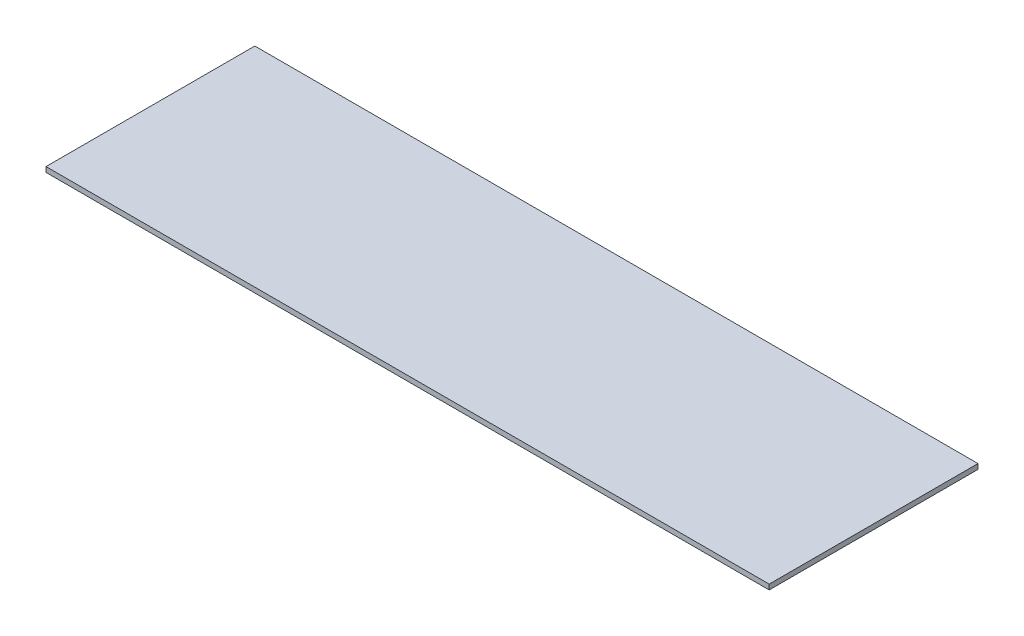
ISO-10303-21;
HEADER;
FILE_DESCRIPTION(('STEP AP214'),'2;1');
FILE_NAME('part.step','',(''),(''),'','','');
FILE_SCHEMA(('AUTOMOTIVE_DESIGN { 1 0 10303 214 1 1 1 1 }'));
ENDSEC;
DATA;
#1=APPLICATION_CONTEXT('core data for automotive mechanical design processes');
#2=APPLICATION_PROTOCOL_DEFINITION('international standard','automotive_design',2000,#1);
#3=PRODUCT_CONTEXT('',#1,'mechanical');
#4=PRODUCT('Part','Part','',(#3));
#5=PRODUCT_RELATED_PRODUCT_CATEGORY('part','',(#4));
#6=PRODUCT_DEFINITION_FORMATION('','',#4);
#7=PRODUCT_DEFINITION_CONTEXT('part definition',#1,'design');
#8=PRODUCT_DEFINITION('design','',#6,#7);
#9=PRODUCT_DEFINITION_SHAPE('','',#8);
#10=(LENGTH_UNIT() NAMED_UNIT(*) SI_UNIT(.MILLI.,.METRE.));
#11=(NAMED_UNIT(*) PLANE_ANGLE_UNIT() SI_UNIT($,.RADIAN.));
#12=(NAMED_UNIT(*) SI_UNIT($,.STERADIAN.) SOLID_ANGLE_UNIT());
#13=UNCERTAINTY_MEASURE_WITH_UNIT(LENGTH_MEASURE(1.E-05),#10,'distance_accuracy_value','');
#14=(GEOMETRIC_REPRESENTATION_CONTEXT(3) GLOBAL_UNCERTAINTY_ASSIGNED_CONTEXT((#13)) GLOBAL_UNIT_ASSIGNED_CONTEXT((#10,
#11,#12)) REPRESENTATION_CONTEXT('',''));
#15=CARTESIAN_POINT('',(0.,0.,0.));
#16=DIRECTION('',(0.,0.,1.));
#17=DIRECTION('',(1.,0.,0.));
#18=AXIS2_PLACEMENT_3D('',#15,#16,#17);
#19=CARTESIAN_POINT('',(-72.8229335931372,-3.175,-90.5464558157828));
#20=DIRECTION('',(-1.,0.,0.));
#21=DIRECTION('',(0.,0.,1.));
#22=AXIS2_PLACEMENT_3D('',#19,#20,#21);
#23=PLANE('',#22);
#24=DIRECTION('',(0.,0.,1.));
#25=VECTOR('',#24,1.);
#26=CARTESIAN_POINT('',(-72.8229335931372,0.,-90.5464558157828));
#27=LINE('',#26,#25);
#28=CARTESIAN_POINT('',(-72.8229335931372,0.,-90.5464558157828));
#29=VERTEX_POINT('',#28);
#30=CARTESIAN_POINT('',(-72.8229335931372,0.,39.6285441842172));
#31=VERTEX_POINT('',#30);
#32=EDGE_CURVE('E97',#29,#31,#27,.T.);
#33=ORIENTED_EDGE('',*,*,#32,.F.);
#34=DIRECTION('',(0.,1.,0.));
#35=VECTOR('',#34,1.);
#36=CARTESIAN_POINT('',(-72.8229335931372,-3.175,-90.5464558157828));
#37=LINE('',#36,#35);
#38=CARTESIAN_POINT('',(-72.8229335931372,-3.175,-90.5464558157828));
#39=VERTEX_POINT('',#38);
#40=EDGE_CURVE('E11',#39,#29,#37,.T.);
#41=ORIENTED_EDGE('',*,*,#40,.F.);
#42=DIRECTION('',(0.,0.,1.));
#43=VECTOR('',#42,1.);
#44=CARTESIAN_POINT('',(-72.8229335931372,-3.175,-90.5464558157828));
#45=LINE('',#44,#43);
#46=CARTESIAN_POINT('',(-72.8229335931372,-3.175,39.6285441842172));
#47=VERTEX_POINT('',#46);
#48=EDGE_CURVE('E91',#39,#47,#45,.T.);
#49=ORIENTED_EDGE('',*,*,#48,.T.);
#50=DIRECTION('',(0.,1.,0.));
#51=VECTOR('',#50,1.);
#52=CARTESIAN_POINT('',(-72.8229335931372,-3.175,39.6285441842172));
#53=LINE('',#52,#51);
#54=EDGE_CURVE('E36',#47,#31,#53,.T.);
#55=ORIENTED_EDGE('',*,*,#54,.T.);
#56=EDGE_LOOP('',(#33,#41,#49,#55));
#57=FACE_BOUND('',#56,.T.);
#58=ADVANCED_FACE('F33',(#57),#23,.T.);
#59=CARTESIAN_POINT('',(-72.8229335931372,-3.175,-90.5464558157828));
#60=DIRECTION('',(0.,0.,-1.));
#61=DIRECTION('',(-1.,0.,0.));
#62=AXIS2_PLACEMENT_3D('',#59,#60,#61);
#63=PLANE('',#62);
#64=DIRECTION('',(-1.,0.,0.));
#65=VECTOR('',#64,1.);
#66=CARTESIAN_POINT('',(-72.8229335931372,0.,-90.5464558157828));
#67=LINE('',#66,#65);
#68=CARTESIAN_POINT('',(378.027066406863,0.,-90.5464558157828));
#69=VERTEX_POINT('',#68);
#70=EDGE_CURVE('E93',#69,#29,#67,.T.);
#71=ORIENTED_EDGE('',*,*,#70,.F.);
#72=DIRECTION('',(0.,1.,0.));
#73=VECTOR('',#72,1.);
#74=CARTESIAN_POINT('',(378.027066406863,-3.175,-90.5464558157828));
#75=LINE('',#74,#73);
#76=CARTESIAN_POINT('',(378.027066406863,-3.175,-90.5464558157828));
#77=VERTEX_POINT('',#76);
#78=EDGE_CURVE('E42',#77,#69,#75,.T.);
#79=ORIENTED_EDGE('',*,*,#78,.F.);
#80=DIRECTION('',(-1.,0.,0.));
#81=VECTOR('',#80,1.);
#82=CARTESIAN_POINT('',(-72.8229335931372,-3.175,-90.5464558157828));
#83=LINE('',#82,#81);
#84=EDGE_CURVE('E88',#77,#39,#83,.T.);
#85=ORIENTED_EDGE('',*,*,#84,.T.);
#86=ORIENTED_EDGE('',*,*,#40,.T.);
#87=EDGE_LOOP('',(#71,#79,#85,#86));
#88=FACE_BOUND('',#87,.T.);
#89=ADVANCED_FACE('F107',(#88),#63,.T.);
#90=CARTESIAN_POINT('',(378.027066406863,-3.175,-90.5464558157828));
#91=DIRECTION('',(1.,0.,0.));
#92=DIRECTION('',(0.,0.,-1.));
#93=AXIS2_PLACEMENT_3D('',#90,#91,#92);
#94=PLANE('',#93);
#95=DIRECTION('',(0.,0.,-1.));
#96=VECTOR('',#95,1.);
#97=CARTESIAN_POINT('',(378.027066406863,0.,-90.5464558157828));
#98=LINE('',#97,#96);
#99=CARTESIAN_POINT('',(378.027066406863,0.,39.6285441842172));
#100=VERTEX_POINT('',#99);
#101=EDGE_CURVE('E83',#100,#69,#98,.T.);
#102=ORIENTED_EDGE('',*,*,#101,.F.);
#103=DIRECTION('',(0.,1.,0.));
#104=VECTOR('',#103,1.);
#105=CARTESIAN_POINT('',(378.027066406863,-3.175,39.6285441842172));
#106=LINE('',#105,#104);
#107=CARTESIAN_POINT('',(378.027066406863,-3.175,39.6285441842172));
#108=VERTEX_POINT('',#107);
#109=EDGE_CURVE('E78',#108,#100,#106,.T.);
#110=ORIENTED_EDGE('',*,*,#109,.F.);
#111=DIRECTION('',(0.,0.,-1.));
#112=VECTOR('',#111,1.);
#113=CARTESIAN_POINT('',(378.027066406863,-3.175,-90.5464558157828));
#114=LINE('',#113,#112);
#115=EDGE_CURVE('E81',#108,#77,#114,.T.);
#116=ORIENTED_EDGE('',*,*,#115,.T.);
#117=ORIENTED_EDGE('',*,*,#78,.T.);
#118=EDGE_LOOP('',(#102,#110,#116,#117));
#119=FACE_BOUND('',#118,.T.);
#120=ADVANCED_FACE('F80',(#119),#94,.T.);
#121=CARTESIAN_POINT('',(-72.8229335931372,-3.175,39.6285441842172));
#122=DIRECTION('',(0.,0.,1.));
#123=DIRECTION('',(1.,0.,0.));
#124=AXIS2_PLACEMENT_3D('',#121,#122,#123);
#125=PLANE('',#124);
#126=DIRECTION('',(1.,0.,0.));
#127=VECTOR('',#126,1.);
#128=CARTESIAN_POINT('',(-72.8229335931372,0.,39.6285441842172));
#129=LINE('',#128,#127);
#130=EDGE_CURVE('E100',#31,#100,#129,.T.);
#131=ORIENTED_EDGE('',*,*,#130,.F.);
#132=ORIENTED_EDGE('',*,*,#54,.F.);
#133=DIRECTION('',(1.,0.,0.));
#134=VECTOR('',#133,1.);
#135=CARTESIAN_POINT('',(-72.8229335931372,-3.175,39.6285441842172));
#136=LINE('',#135,#134);
#137=EDGE_CURVE('E87',#47,#108,#136,.T.);
#138=ORIENTED_EDGE('',*,*,#137,.T.);
#139=ORIENTED_EDGE('',*,*,#109,.T.);
#140=EDGE_LOOP('',(#131,#132,#138,#139));
#141=FACE_BOUND('',#140,.T.);
#142=ADVANCED_FACE('F90',(#141),#125,.T.);
#143=CARTESIAN_POINT('',(-72.8229335931372,-3.175,39.6285441842172));
#144=DIRECTION('',(0.,1.,0.));
#145=DIRECTION('',(0.,0.,1.));
#146=AXIS2_PLACEMENT_3D('',#143,#144,#145);
#147=PLANE('',#146);
#148=ORIENTED_EDGE('',*,*,#48,.F.);
#149=ORIENTED_EDGE('',*,*,#84,.F.);
#150=ORIENTED_EDGE('',*,*,#115,.F.);
#151=ORIENTED_EDGE('',*,*,#137,.F.);
#152=EDGE_LOOP('',(#148,#149,#150,#151));
#153=FACE_BOUND('',#152,.T.);
#154=ADVANCED_FACE('F86',(#153),#147,.F.);
#155=CARTESIAN_POINT('',(-72.8229335931372,0.,39.6285441842172));
#156=DIRECTION('',(0.,1.,0.));
#157=DIRECTION('',(0.,0.,1.));
#158=AXIS2_PLACEMENT_3D('',#155,#156,#157);
#159=PLANE('',#158);
#160=ORIENTED_EDGE('',*,*,#32,.T.);
#161=ORIENTED_EDGE('',*,*,#130,.T.);
#162=ORIENTED_EDGE('',*,*,#101,.T.);
#163=ORIENTED_EDGE('',*,*,#70,.T.);
#164=EDGE_LOOP('',(#160,#161,#162,#163));
#165=FACE_BOUND('',#164,.T.);
#166=ADVANCED_FACE('F106',(#165),#159,.T.);
#167=CLOSED_SHELL('',(#58,#89,#120,#142,#154,#166));
#168=MANIFOLD_SOLID_BREP('B2',#167);
#169=ADVANCED_BREP_SHAPE_REPRESENTATION('',(#18,#168),#14);
#170=SHAPE_DEFINITION_REPRESENTATION(#9,#169);
ENDSEC;
END-ISO-10303-21;
